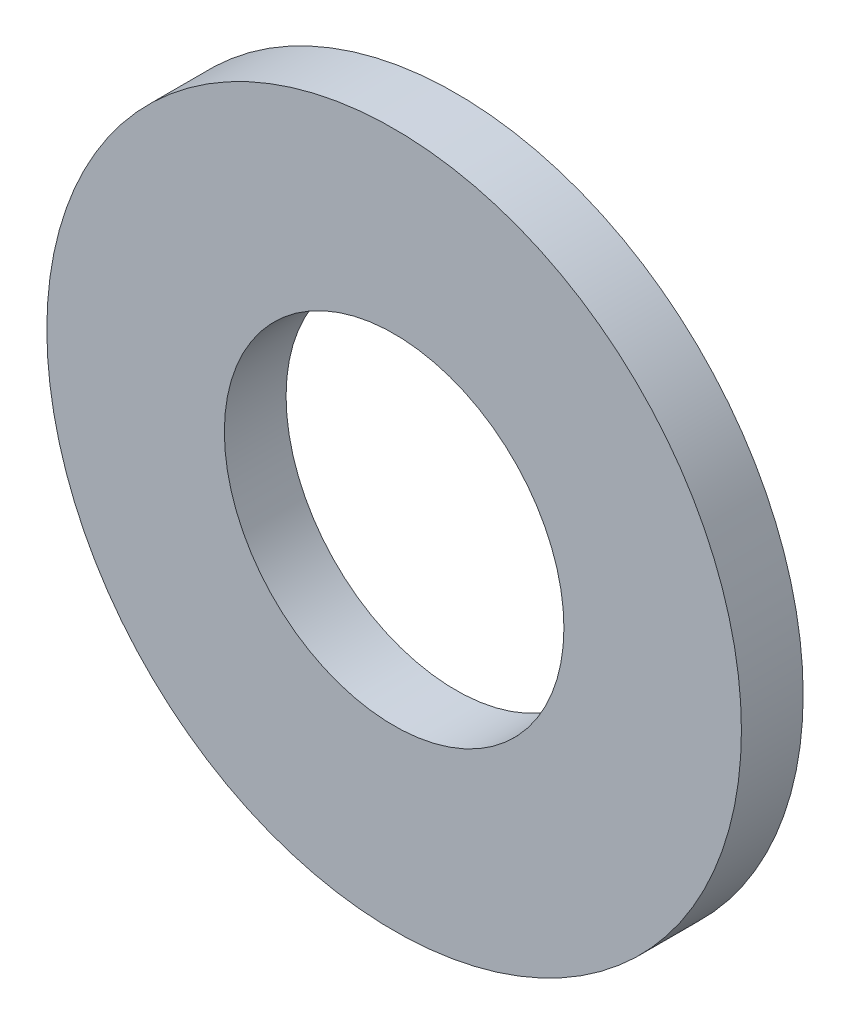
ISO-10303-21;
HEADER;
FILE_DESCRIPTION(('STEP AP214'),'2;1');
FILE_NAME('part.step','',(''),(''),'','','');
FILE_SCHEMA(('AUTOMOTIVE_DESIGN { 1 0 10303 214 1 1 1 1 }'));
ENDSEC;
DATA;
#1=APPLICATION_CONTEXT('core data for automotive mechanical design processes');
#2=APPLICATION_PROTOCOL_DEFINITION('international standard','automotive_design',2000,#1);
#3=PRODUCT_CONTEXT('',#1,'mechanical');
#4=PRODUCT('Part','Part','',(#3));
#5=PRODUCT_RELATED_PRODUCT_CATEGORY('part','',(#4));
#6=PRODUCT_DEFINITION_FORMATION('','',#4);
#7=PRODUCT_DEFINITION_CONTEXT('part definition',#1,'design');
#8=PRODUCT_DEFINITION('design','',#6,#7);
#9=PRODUCT_DEFINITION_SHAPE('','',#8);
#10=(LENGTH_UNIT() NAMED_UNIT(*) SI_UNIT(.MILLI.,.METRE.));
#11=(NAMED_UNIT(*) PLANE_ANGLE_UNIT() SI_UNIT($,.RADIAN.));
#12=(NAMED_UNIT(*) SI_UNIT($,.STERADIAN.) SOLID_ANGLE_UNIT());
#13=UNCERTAINTY_MEASURE_WITH_UNIT(LENGTH_MEASURE(1.E-05),#10,'distance_accuracy_value','');
#14=(GEOMETRIC_REPRESENTATION_CONTEXT(3) GLOBAL_UNCERTAINTY_ASSIGNED_CONTEXT((#13)) GLOBAL_UNIT_ASSIGNED_CONTEXT((#10,
#11,#12)) REPRESENTATION_CONTEXT('',''));
#15=CARTESIAN_POINT('',(0.,0.,0.));
#16=DIRECTION('',(0.,0.,1.));
#17=DIRECTION('',(1.,0.,0.));
#18=AXIS2_PLACEMENT_3D('',#15,#16,#17);
#19=CARTESIAN_POINT('',(2.2,0.,0.));
#20=DIRECTION('',(0.,0.,-1.));
#21=DIRECTION('',(-1.,0.,0.));
#22=AXIS2_PLACEMENT_3D('',#19,#20,#21);
#23=PLANE('',#22);
#24=CARTESIAN_POINT('',(0.,0.,0.));
#25=DIRECTION('',(0.,0.,-1.));
#26=DIRECTION('',(-1.,0.,0.));
#27=AXIS2_PLACEMENT_3D('',#24,#25,#26);
#28=CIRCLE('',#27,4.5);
#29=CARTESIAN_POINT('',(-4.5,0.,0.));
#30=VERTEX_POINT('',#29);
#31=EDGE_CURVE('E10',#30,#30,#28,.T.);
#32=ORIENTED_EDGE('',*,*,#31,.T.);
#33=EDGE_LOOP('',(#32));
#34=FACE_BOUND('',#33,.T.);
#35=CARTESIAN_POINT('',(0.,0.,0.));
#36=DIRECTION('',(0.,0.,-1.));
#37=DIRECTION('',(-1.,0.,0.));
#38=AXIS2_PLACEMENT_3D('',#35,#36,#37);
#39=CIRCLE('',#38,2.2);
#40=CARTESIAN_POINT('',(-2.2,0.,0.));
#41=VERTEX_POINT('',#40);
#42=EDGE_CURVE('E42',#41,#41,#39,.T.);
#43=ORIENTED_EDGE('',*,*,#42,.F.);
#44=EDGE_LOOP('',(#43));
#45=FACE_BOUND('',#44,.T.);
#46=ADVANCED_FACE('F28',(#34,#45),#23,.T.);
#47=CARTESIAN_POINT('',(0.,0.,0.8));
#48=DIRECTION('',(0.,0.,-1.));
#49=DIRECTION('',(-1.,0.,0.));
#50=AXIS2_PLACEMENT_3D('',#47,#48,#49);
#51=CYLINDRICAL_SURFACE('',#50,4.5);
#52=CARTESIAN_POINT('',(0.,0.,0.8));
#53=DIRECTION('',(0.,0.,-1.));
#54=DIRECTION('',(-1.,0.,0.));
#55=AXIS2_PLACEMENT_3D('',#52,#53,#54);
#56=CIRCLE('',#55,4.5);
#57=CARTESIAN_POINT('',(-4.5,0.,0.8));
#58=VERTEX_POINT('',#57);
#59=EDGE_CURVE('E34',#58,#58,#56,.T.);
#60=ORIENTED_EDGE('',*,*,#59,.T.);
#61=EDGE_LOOP('',(#60));
#62=FACE_BOUND('',#61,.T.);
#63=ORIENTED_EDGE('',*,*,#31,.F.);
#64=EDGE_LOOP('',(#63));
#65=FACE_BOUND('',#64,.T.);
#66=ADVANCED_FACE('F52',(#62,#65),#51,.T.);
#67=CARTESIAN_POINT('',(4.5,0.,0.8));
#68=DIRECTION('',(0.,0.,1.));
#69=DIRECTION('',(1.,0.,0.));
#70=AXIS2_PLACEMENT_3D('',#67,#68,#69);
#71=PLANE('',#70);
#72=CARTESIAN_POINT('',(0.,0.,0.8));
#73=DIRECTION('',(0.,0.,-1.));
#74=DIRECTION('',(-1.,0.,0.));
#75=AXIS2_PLACEMENT_3D('',#72,#73,#74);
#76=CIRCLE('',#75,2.2);
#77=CARTESIAN_POINT('',(-2.2,0.,0.8));
#78=VERTEX_POINT('',#77);
#79=EDGE_CURVE('E38',#78,#78,#76,.T.);
#80=ORIENTED_EDGE('',*,*,#79,.T.);
#81=EDGE_LOOP('',(#80));
#82=FACE_BOUND('',#81,.T.);
#83=ORIENTED_EDGE('',*,*,#59,.F.);
#84=EDGE_LOOP('',(#83));
#85=FACE_BOUND('',#84,.T.);
#86=ADVANCED_FACE('F56',(#82,#85),#71,.T.);
#87=CARTESIAN_POINT('',(0.,0.,0.8));
#88=DIRECTION('',(0.,0.,-1.));
#89=DIRECTION('',(-1.,0.,0.));
#90=AXIS2_PLACEMENT_3D('',#87,#88,#89);
#91=CYLINDRICAL_SURFACE('',#90,2.2);
#92=ORIENTED_EDGE('',*,*,#42,.T.);
#93=EDGE_LOOP('',(#92));
#94=FACE_BOUND('',#93,.T.);
#95=ORIENTED_EDGE('',*,*,#79,.F.);
#96=EDGE_LOOP('',(#95));
#97=FACE_BOUND('',#96,.T.);
#98=ADVANCED_FACE('F48',(#94,#97),#91,.F.);
#99=CLOSED_SHELL('',(#46,#66,#86,#98));
#100=MANIFOLD_SOLID_BREP('B2',#99);
#101=ADVANCED_BREP_SHAPE_REPRESENTATION('',(#18,#100),#14);
#102=SHAPE_DEFINITION_REPRESENTATION(#9,#101);
ENDSEC;
END-ISO-10303-21;
